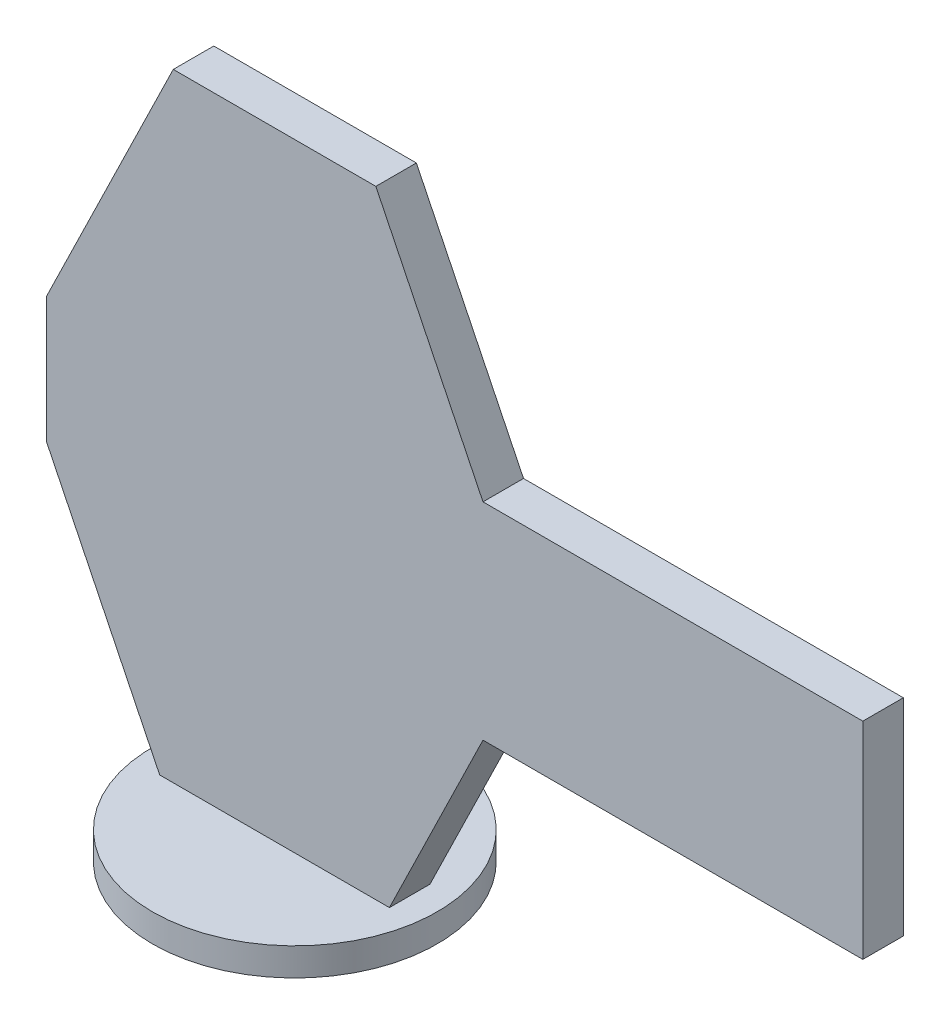
ISO-10303-21;
HEADER;
FILE_DESCRIPTION(('STEP AP214'),'2;1');
FILE_NAME('part.step','',(''),(''),'','','');
FILE_SCHEMA(('AUTOMOTIVE_DESIGN { 1 0 10303 214 1 1 1 1 }'));
ENDSEC;
DATA;
#1=APPLICATION_CONTEXT('core data for automotive mechanical design processes');
#2=APPLICATION_PROTOCOL_DEFINITION('international standard','automotive_design',2000,#1);
#3=PRODUCT_CONTEXT('',#1,'mechanical');
#4=PRODUCT('Part','Part','',(#3));
#5=PRODUCT_RELATED_PRODUCT_CATEGORY('part','',(#4));
#6=PRODUCT_DEFINITION_FORMATION('','',#4);
#7=PRODUCT_DEFINITION_CONTEXT('part definition',#1,'design');
#8=PRODUCT_DEFINITION('design','',#6,#7);
#9=PRODUCT_DEFINITION_SHAPE('','',#8);
#10=(LENGTH_UNIT() NAMED_UNIT(*) SI_UNIT(.MILLI.,.METRE.));
#11=(NAMED_UNIT(*) PLANE_ANGLE_UNIT() SI_UNIT($,.RADIAN.));
#12=(NAMED_UNIT(*) SI_UNIT($,.STERADIAN.) SOLID_ANGLE_UNIT());
#13=UNCERTAINTY_MEASURE_WITH_UNIT(LENGTH_MEASURE(1.E-05),#10,'distance_accuracy_value','');
#14=(GEOMETRIC_REPRESENTATION_CONTEXT(3) GLOBAL_UNCERTAINTY_ASSIGNED_CONTEXT((#13)) GLOBAL_UNIT_ASSIGNED_CONTEXT((#10,
#11,#12)) REPRESENTATION_CONTEXT('',''));
#15=CARTESIAN_POINT('',(0.,0.,0.));
#16=DIRECTION('',(0.,0.,1.));
#17=DIRECTION('',(1.,0.,0.));
#18=AXIS2_PLACEMENT_3D('',#15,#16,#17);
#19=CARTESIAN_POINT('',(0.,2.2,0.));
#20=DIRECTION('',(0.,-1.,0.));
#21=DIRECTION('',(0.,0.,-1.));
#22=AXIS2_PLACEMENT_3D('',#19,#20,#21);
#23=CYLINDRICAL_SURFACE('',#22,11.25);
#24=CARTESIAN_POINT('',(0.,2.2,0.));
#25=DIRECTION('',(0.,1.,0.));
#26=DIRECTION('',(0.,0.,1.));
#27=AXIS2_PLACEMENT_3D('',#24,#25,#26);
#28=CIRCLE('',#27,11.25);
#29=CARTESIAN_POINT('',(0.,2.2,11.25));
#30=VERTEX_POINT('',#29);
#31=EDGE_CURVE('E11',#30,#30,#28,.T.);
#32=ORIENTED_EDGE('',*,*,#31,.F.);
#33=EDGE_LOOP('',(#32));
#34=FACE_BOUND('',#33,.T.);
#35=CARTESIAN_POINT('',(0.,0.,0.));
#36=DIRECTION('',(0.,1.,0.));
#37=DIRECTION('',(0.,0.,1.));
#38=AXIS2_PLACEMENT_3D('',#35,#36,#37);
#39=CIRCLE('',#38,11.25);
#40=CARTESIAN_POINT('',(0.,0.,11.25));
#41=VERTEX_POINT('',#40);
#42=EDGE_CURVE('E48',#41,#41,#39,.T.);
#43=ORIENTED_EDGE('',*,*,#42,.T.);
#44=EDGE_LOOP('',(#43));
#45=FACE_BOUND('',#44,.T.);
#46=ADVANCED_FACE('F45',(#34,#45),#23,.T.);
#47=CARTESIAN_POINT('',(0.,2.2,0.));
#48=DIRECTION('',(0.,1.,0.));
#49=DIRECTION('',(0.,0.,1.));
#50=AXIS2_PLACEMENT_3D('',#47,#48,#49);
#51=PLANE('',#50);
#52=DIRECTION('',(-1.,0.,0.));
#53=VECTOR('',#52,1.);
#54=CARTESIAN_POINT('',(0.,2.2,-1.6));
#55=LINE('',#54,#53);
#56=CARTESIAN_POINT('',(9.07317073170731,2.2,-1.6));
#57=VERTEX_POINT('',#56);
#58=CARTESIAN_POINT('',(-9.07317073170732,2.2,-1.6));
#59=VERTEX_POINT('',#58);
#60=EDGE_CURVE('E68',#57,#59,#55,.T.);
#61=ORIENTED_EDGE('',*,*,#60,.F.);
#62=DIRECTION('',(0.,0.,-1.));
#63=VECTOR('',#62,1.);
#64=CARTESIAN_POINT('',(9.07317073170731,2.2,0.));
#65=LINE('',#64,#63);
#66=CARTESIAN_POINT('',(9.07317073170731,2.2,1.6));
#67=VERTEX_POINT('',#66);
#68=EDGE_CURVE('E233',#67,#57,#65,.T.);
#69=ORIENTED_EDGE('',*,*,#68,.F.);
#70=DIRECTION('',(-1.,0.,0.));
#71=VECTOR('',#70,1.);
#72=CARTESIAN_POINT('',(0.,2.2,1.6));
#73=LINE('',#72,#71);
#74=CARTESIAN_POINT('',(-9.07317073170732,2.2,1.6));
#75=VERTEX_POINT('',#74);
#76=EDGE_CURVE('E215',#67,#75,#73,.T.);
#77=ORIENTED_EDGE('',*,*,#76,.T.);
#78=DIRECTION('',(0.,0.,1.));
#79=VECTOR('',#78,1.);
#80=CARTESIAN_POINT('',(-9.07317073170732,2.2,0.));
#81=LINE('',#80,#79);
#82=EDGE_CURVE('E230',#59,#75,#81,.T.);
#83=ORIENTED_EDGE('',*,*,#82,.F.);
#84=EDGE_LOOP('',(#61,#69,#77,#83));
#85=FACE_BOUND('',#84,.T.);
#86=ORIENTED_EDGE('',*,*,#31,.T.);
#87=EDGE_LOOP('',(#86));
#88=FACE_BOUND('',#87,.T.);
#89=ADVANCED_FACE('F246',(#85,#88),#51,.T.);
#90=CARTESIAN_POINT('',(0.,0.,0.));
#91=DIRECTION('',(0.,1.,0.));
#92=DIRECTION('',(0.,0.,1.));
#93=AXIS2_PLACEMENT_3D('',#90,#91,#92);
#94=PLANE('',#93);
#95=ORIENTED_EDGE('',*,*,#42,.F.);
#96=EDGE_LOOP('',(#95));
#97=FACE_BOUND('',#96,.T.);
#98=ADVANCED_FACE('F243',(#97),#94,.F.);
#99=CARTESIAN_POINT('',(-8.,51.,-1.6));
#100=DIRECTION('',(-0.8987684456439,0.438423632021414,0.));
#101=DIRECTION('',(-0.438423632021415,-0.8987684456439,0.));
#102=AXIS2_PLACEMENT_3D('',#99,#100,#101);
#103=PLANE('',#102);
#104=DIRECTION('',(0.,0.,1.));
#105=VECTOR('',#104,1.);
#106=CARTESIAN_POINT('',(-18.,30.5,-1.6));
#107=LINE('',#106,#105);
#108=CARTESIAN_POINT('',(-18.,30.5,-1.6));
#109=VERTEX_POINT('',#108);
#110=CARTESIAN_POINT('',(-18.,30.5,1.6));
#111=VERTEX_POINT('',#110);
#112=EDGE_CURVE('E211',#109,#111,#107,.T.);
#113=ORIENTED_EDGE('',*,*,#112,.T.);
#114=DIRECTION('',(-0.438423632021414,-0.8987684456439,0.));
#115=VECTOR('',#114,1.);
#116=CARTESIAN_POINT('',(-8.,51.,1.6));
#117=LINE('',#116,#115);
#118=CARTESIAN_POINT('',(-8.,51.,1.6));
#119=VERTEX_POINT('',#118);
#120=EDGE_CURVE('E170',#119,#111,#117,.T.);
#121=ORIENTED_EDGE('',*,*,#120,.F.);
#122=DIRECTION('',(0.,0.,1.));
#123=VECTOR('',#122,1.);
#124=CARTESIAN_POINT('',(-8.,51.,-1.6));
#125=LINE('',#124,#123);
#126=CARTESIAN_POINT('',(-8.,51.,-1.6));
#127=VERTEX_POINT('',#126);
#128=EDGE_CURVE('E212',#127,#119,#125,.T.);
#129=ORIENTED_EDGE('',*,*,#128,.F.);
#130=DIRECTION('',(-0.438423632021414,-0.8987684456439,0.));
#131=VECTOR('',#130,1.);
#132=CARTESIAN_POINT('',(-8.,51.,-1.6));
#133=LINE('',#132,#131);
#134=EDGE_CURVE('E190',#127,#109,#133,.T.);
#135=ORIENTED_EDGE('',*,*,#134,.T.);
#136=EDGE_LOOP('',(#113,#121,#129,#135));
#137=FACE_BOUND('',#136,.T.);
#138=ADVANCED_FACE('F245',(#137),#103,.T.);
#139=CARTESIAN_POINT('',(-8.,51.,-1.6));
#140=DIRECTION('',(0.,1.,0.));
#141=DIRECTION('',(0.,0.,1.));
#142=AXIS2_PLACEMENT_3D('',#139,#140,#141);
#143=PLANE('',#142);
#144=ORIENTED_EDGE('',*,*,#128,.T.);
#145=DIRECTION('',(-1.,0.,0.));
#146=VECTOR('',#145,1.);
#147=CARTESIAN_POINT('',(-8.,51.,1.6));
#148=LINE('',#147,#146);
#149=CARTESIAN_POINT('',(8.,51.,1.6));
#150=VERTEX_POINT('',#149);
#151=EDGE_CURVE('E186',#150,#119,#148,.T.);
#152=ORIENTED_EDGE('',*,*,#151,.F.);
#153=DIRECTION('',(0.,0.,1.));
#154=VECTOR('',#153,1.);
#155=CARTESIAN_POINT('',(8.,51.,-1.6));
#156=LINE('',#155,#154);
#157=CARTESIAN_POINT('',(8.,51.,-1.6));
#158=VERTEX_POINT('',#157);
#159=EDGE_CURVE('E216',#158,#150,#156,.T.);
#160=ORIENTED_EDGE('',*,*,#159,.F.);
#161=DIRECTION('',(-1.,0.,0.));
#162=VECTOR('',#161,1.);
#163=CARTESIAN_POINT('',(-8.,51.,-1.6));
#164=LINE('',#163,#162);
#165=EDGE_CURVE('E207',#158,#127,#164,.T.);
#166=ORIENTED_EDGE('',*,*,#165,.T.);
#167=EDGE_LOOP('',(#144,#152,#160,#166));
#168=FACE_BOUND('',#167,.T.);
#169=ADVANCED_FACE('F251',(#168),#143,.T.);
#170=CARTESIAN_POINT('',(8.,51.,-1.6));
#171=DIRECTION('',(0.898768445643899,0.438423632021415,0.));
#172=DIRECTION('',(-0.438423632021415,0.898768445643899,0.));
#173=AXIS2_PLACEMENT_3D('',#170,#171,#172);
#174=PLANE('',#173);
#175=DIRECTION('',(0.,0.,1.));
#176=VECTOR('',#175,1.);
#177=CARTESIAN_POINT('',(16.4634146341464,33.65,-1.6));
#178=LINE('',#177,#176);
#179=CARTESIAN_POINT('',(16.4634146341464,33.65,-1.6));
#180=VERTEX_POINT('',#179);
#181=CARTESIAN_POINT('',(16.4634146341464,33.65,1.6));
#182=VERTEX_POINT('',#181);
#183=EDGE_CURVE('E167',#180,#182,#178,.T.);
#184=ORIENTED_EDGE('',*,*,#183,.F.);
#185=DIRECTION('',(-0.438423632021415,0.898768445643899,0.));
#186=VECTOR('',#185,1.);
#187=CARTESIAN_POINT('',(8.,51.,-1.6));
#188=LINE('',#187,#186);
#189=EDGE_CURVE('E204',#180,#158,#188,.T.);
#190=ORIENTED_EDGE('',*,*,#189,.T.);
#191=ORIENTED_EDGE('',*,*,#159,.T.);
#192=DIRECTION('',(-0.438423632021415,0.898768445643899,0.));
#193=VECTOR('',#192,1.);
#194=CARTESIAN_POINT('',(8.,51.,1.6));
#195=LINE('',#194,#193);
#196=EDGE_CURVE('E183',#182,#150,#195,.T.);
#197=ORIENTED_EDGE('',*,*,#196,.F.);
#198=EDGE_LOOP('',(#184,#190,#191,#197));
#199=FACE_BOUND('',#198,.T.);
#200=ADVANCED_FACE('F287',(#199),#174,.T.);
#201=CARTESIAN_POINT('',(18.,20.5,-1.6));
#202=DIRECTION('',(0.8987684456439,-0.438423632021415,0.));
#203=DIRECTION('',(0.438423632021415,0.8987684456439,0.));
#204=AXIS2_PLACEMENT_3D('',#201,#202,#203);
#205=PLANE('',#204);
#206=DIRECTION('',(0.,0.,-1.));
#207=VECTOR('',#206,1.);
#208=CARTESIAN_POINT('',(16.4634146341463,17.35,-1.6));
#209=LINE('',#208,#207);
#210=CARTESIAN_POINT('',(16.4634146341463,17.35,1.6));
#211=VERTEX_POINT('',#210);
#212=CARTESIAN_POINT('',(16.4634146341463,17.35,-1.6));
#213=VERTEX_POINT('',#212);
#214=EDGE_CURVE('E131',#211,#213,#209,.T.);
#215=ORIENTED_EDGE('',*,*,#214,.F.);
#216=DIRECTION('',(0.438423632021415,0.8987684456439,0.));
#217=VECTOR('',#216,1.);
#218=CARTESIAN_POINT('',(18.,20.5,1.6));
#219=LINE('',#218,#217);
#220=EDGE_CURVE('E179',#67,#211,#219,.T.);
#221=ORIENTED_EDGE('',*,*,#220,.F.);
#222=ORIENTED_EDGE('',*,*,#68,.T.);
#223=DIRECTION('',(0.438423632021415,0.8987684456439,0.));
#224=VECTOR('',#223,1.);
#225=CARTESIAN_POINT('',(18.,20.5,-1.6));
#226=LINE('',#225,#224);
#227=EDGE_CURVE('E201',#57,#213,#226,.T.);
#228=ORIENTED_EDGE('',*,*,#227,.T.);
#229=EDGE_LOOP('',(#215,#221,#222,#228));
#230=FACE_BOUND('',#229,.T.);
#231=ADVANCED_FACE('F298',(#230),#205,.T.);
#232=CARTESIAN_POINT('',(-8.,0.,-1.6));
#233=DIRECTION('',(-0.8987684456439,-0.438423632021414,0.));
#234=DIRECTION('',(0.438423632021414,-0.8987684456439,0.));
#235=AXIS2_PLACEMENT_3D('',#232,#233,#234);
#236=PLANE('',#235);
#237=DIRECTION('',(0.438423632021414,-0.8987684456439,0.));
#238=VECTOR('',#237,1.);
#239=CARTESIAN_POINT('',(-8.,0.,-1.6));
#240=LINE('',#239,#238);
#241=CARTESIAN_POINT('',(-18.,20.5,-1.6));
#242=VERTEX_POINT('',#241);
#243=EDGE_CURVE('E198',#242,#59,#240,.T.);
#244=ORIENTED_EDGE('',*,*,#243,.T.);
#245=ORIENTED_EDGE('',*,*,#82,.T.);
#246=DIRECTION('',(0.438423632021414,-0.8987684456439,0.));
#247=VECTOR('',#246,1.);
#248=CARTESIAN_POINT('',(-8.,0.,1.6));
#249=LINE('',#248,#247);
#250=CARTESIAN_POINT('',(-18.,20.5,1.6));
#251=VERTEX_POINT('',#250);
#252=EDGE_CURVE('E60',#251,#75,#249,.T.);
#253=ORIENTED_EDGE('',*,*,#252,.F.);
#254=DIRECTION('',(0.,0.,1.));
#255=VECTOR('',#254,1.);
#256=CARTESIAN_POINT('',(-18.,20.5,-1.6));
#257=LINE('',#256,#255);
#258=EDGE_CURVE('E220',#242,#251,#257,.T.);
#259=ORIENTED_EDGE('',*,*,#258,.F.);
#260=EDGE_LOOP('',(#244,#245,#253,#259));
#261=FACE_BOUND('',#260,.T.);
#262=ADVANCED_FACE('F309',(#261),#236,.T.);
#263=CARTESIAN_POINT('',(-18.,30.5,-1.6));
#264=DIRECTION('',(-1.,0.,0.));
#265=DIRECTION('',(0.,-1.,0.));
#266=AXIS2_PLACEMENT_3D('',#263,#264,#265);
#267=PLANE('',#266);
#268=ORIENTED_EDGE('',*,*,#258,.T.);
#269=DIRECTION('',(0.,-1.,0.));
#270=VECTOR('',#269,1.);
#271=CARTESIAN_POINT('',(-18.,30.5,1.6));
#272=LINE('',#271,#270);
#273=EDGE_CURVE('E174',#111,#251,#272,.T.);
#274=ORIENTED_EDGE('',*,*,#273,.F.);
#275=ORIENTED_EDGE('',*,*,#112,.F.);
#276=DIRECTION('',(0.,-1.,0.));
#277=VECTOR('',#276,1.);
#278=CARTESIAN_POINT('',(-18.,30.5,-1.6));
#279=LINE('',#278,#277);
#280=EDGE_CURVE('E194',#109,#242,#279,.T.);
#281=ORIENTED_EDGE('',*,*,#280,.T.);
#282=EDGE_LOOP('',(#268,#274,#275,#281));
#283=FACE_BOUND('',#282,.T.);
#284=ADVANCED_FACE('F318',(#283),#267,.T.);
#285=CARTESIAN_POINT('',(0.,0.,-1.6));
#286=DIRECTION('',(0.,0.,-1.));
#287=DIRECTION('',(-1.,0.,0.));
#288=AXIS2_PLACEMENT_3D('',#285,#286,#287);
#289=PLANE('',#288);
#290=ORIENTED_EDGE('',*,*,#189,.F.);
#291=DIRECTION('',(-1.,0.,0.));
#292=VECTOR('',#291,1.);
#293=CARTESIAN_POINT('',(13.1341923238721,33.65,-1.6));
#294=LINE('',#293,#292);
#295=CARTESIAN_POINT('',(46.4634146341463,33.65,-1.6));
#296=VERTEX_POINT('',#295);
#297=EDGE_CURVE('E146',#296,#180,#294,.T.);
#298=ORIENTED_EDGE('',*,*,#297,.F.);
#299=DIRECTION('',(0.,1.,0.));
#300=VECTOR('',#299,1.);
#301=CARTESIAN_POINT('',(46.4634146341463,33.65,-1.6));
#302=LINE('',#301,#300);
#303=CARTESIAN_POINT('',(46.4634146341463,17.35,-1.6));
#304=VERTEX_POINT('',#303);
#305=EDGE_CURVE('E135',#304,#296,#302,.T.);
#306=ORIENTED_EDGE('',*,*,#305,.F.);
#307=DIRECTION('',(1.,0.,0.));
#308=VECTOR('',#307,1.);
#309=CARTESIAN_POINT('',(13.1341923238721,17.35,-1.6));
#310=LINE('',#309,#308);
#311=EDGE_CURVE('E125',#213,#304,#310,.T.);
#312=ORIENTED_EDGE('',*,*,#311,.F.);
#313=ORIENTED_EDGE('',*,*,#227,.F.);
#314=ORIENTED_EDGE('',*,*,#60,.T.);
#315=ORIENTED_EDGE('',*,*,#243,.F.);
#316=ORIENTED_EDGE('',*,*,#280,.F.);
#317=ORIENTED_EDGE('',*,*,#134,.F.);
#318=ORIENTED_EDGE('',*,*,#165,.F.);
#319=EDGE_LOOP('',(#290,#298,#306,#312,#313,#314,#315,#316,#317,#318));
#320=FACE_BOUND('',#319,.T.);
#321=ADVANCED_FACE('F149',(#320),#289,.T.);
#322=CARTESIAN_POINT('',(0.,0.,1.6));
#323=DIRECTION('',(0.,0.,-1.));
#324=DIRECTION('',(-1.,0.,0.));
#325=AXIS2_PLACEMENT_3D('',#322,#323,#324);
#326=PLANE('',#325);
#327=DIRECTION('',(-1.,0.,0.));
#328=VECTOR('',#327,1.);
#329=CARTESIAN_POINT('',(13.1341923238721,33.65,1.6));
#330=LINE('',#329,#328);
#331=CARTESIAN_POINT('',(46.4634146341463,33.65,1.6));
#332=VERTEX_POINT('',#331);
#333=EDGE_CURVE('E136',#332,#182,#330,.T.);
#334=ORIENTED_EDGE('',*,*,#333,.T.);
#335=ORIENTED_EDGE('',*,*,#196,.T.);
#336=ORIENTED_EDGE('',*,*,#151,.T.);
#337=ORIENTED_EDGE('',*,*,#120,.T.);
#338=ORIENTED_EDGE('',*,*,#273,.T.);
#339=ORIENTED_EDGE('',*,*,#252,.T.);
#340=ORIENTED_EDGE('',*,*,#76,.F.);
#341=ORIENTED_EDGE('',*,*,#220,.T.);
#342=DIRECTION('',(1.,0.,0.));
#343=VECTOR('',#342,1.);
#344=CARTESIAN_POINT('',(13.1341923238721,17.35,1.6));
#345=LINE('',#344,#343);
#346=CARTESIAN_POINT('',(46.4634146341463,17.35,1.6));
#347=VERTEX_POINT('',#346);
#348=EDGE_CURVE('E155',#211,#347,#345,.T.);
#349=ORIENTED_EDGE('',*,*,#348,.T.);
#350=DIRECTION('',(0.,1.,0.));
#351=VECTOR('',#350,1.);
#352=CARTESIAN_POINT('',(46.4634146341463,33.65,1.6));
#353=LINE('',#352,#351);
#354=EDGE_CURVE('E143',#347,#332,#353,.T.);
#355=ORIENTED_EDGE('',*,*,#354,.T.);
#356=EDGE_LOOP('',(#334,#335,#336,#337,#338,#339,#340,#341,#349,#355));
#357=FACE_BOUND('',#356,.T.);
#358=ADVANCED_FACE('F336',(#357),#326,.F.);
#359=CARTESIAN_POINT('',(13.1341923238721,33.65,-1.6));
#360=DIRECTION('',(0.,1.,0.));
#361=DIRECTION('',(0.,0.,1.));
#362=AXIS2_PLACEMENT_3D('',#359,#360,#361);
#363=PLANE('',#362);
#364=ORIENTED_EDGE('',*,*,#297,.T.);
#365=ORIENTED_EDGE('',*,*,#183,.T.);
#366=ORIENTED_EDGE('',*,*,#333,.F.);
#367=DIRECTION('',(0.,0.,1.));
#368=VECTOR('',#367,1.);
#369=CARTESIAN_POINT('',(46.4634146341463,33.65,-1.6));
#370=LINE('',#369,#368);
#371=EDGE_CURVE('E145',#296,#332,#370,.T.);
#372=ORIENTED_EDGE('',*,*,#371,.F.);
#373=EDGE_LOOP('',(#364,#365,#366,#372));
#374=FACE_BOUND('',#373,.T.);
#375=ADVANCED_FACE('F346',(#374),#363,.T.);
#376=CARTESIAN_POINT('',(46.4634146341463,33.65,-1.6));
#377=DIRECTION('',(1.,0.,0.));
#378=DIRECTION('',(0.,0.,-1.));
#379=AXIS2_PLACEMENT_3D('',#376,#377,#378);
#380=PLANE('',#379);
#381=ORIENTED_EDGE('',*,*,#354,.F.);
#382=DIRECTION('',(0.,0.,1.));
#383=VECTOR('',#382,1.);
#384=CARTESIAN_POINT('',(46.4634146341463,17.35,-1.6));
#385=LINE('',#384,#383);
#386=EDGE_CURVE('E128',#304,#347,#385,.T.);
#387=ORIENTED_EDGE('',*,*,#386,.F.);
#388=ORIENTED_EDGE('',*,*,#305,.T.);
#389=ORIENTED_EDGE('',*,*,#371,.T.);
#390=EDGE_LOOP('',(#381,#387,#388,#389));
#391=FACE_BOUND('',#390,.T.);
#392=ADVANCED_FACE('F140',(#391),#380,.T.);
#393=CARTESIAN_POINT('',(13.1341923238721,17.35,-1.6));
#394=DIRECTION('',(0.,-1.,0.));
#395=DIRECTION('',(0.,0.,-1.));
#396=AXIS2_PLACEMENT_3D('',#393,#394,#395);
#397=PLANE('',#396);
#398=ORIENTED_EDGE('',*,*,#348,.F.);
#399=ORIENTED_EDGE('',*,*,#214,.T.);
#400=ORIENTED_EDGE('',*,*,#311,.T.);
#401=ORIENTED_EDGE('',*,*,#386,.T.);
#402=EDGE_LOOP('',(#398,#399,#400,#401));
#403=FACE_BOUND('',#402,.T.);
#404=ADVANCED_FACE('F127',(#403),#397,.T.);
#405=CLOSED_SHELL('',(#46,#89,#98,#138,#169,#200,#231,#262,#284,#321,#358,#375,#392,#404));
#406=MANIFOLD_SOLID_BREP('B2',#405);
#407=ADVANCED_BREP_SHAPE_REPRESENTATION('',(#18,#406),#14);
#408=SHAPE_DEFINITION_REPRESENTATION(#9,#407);
ENDSEC;
END-ISO-10303-21;
